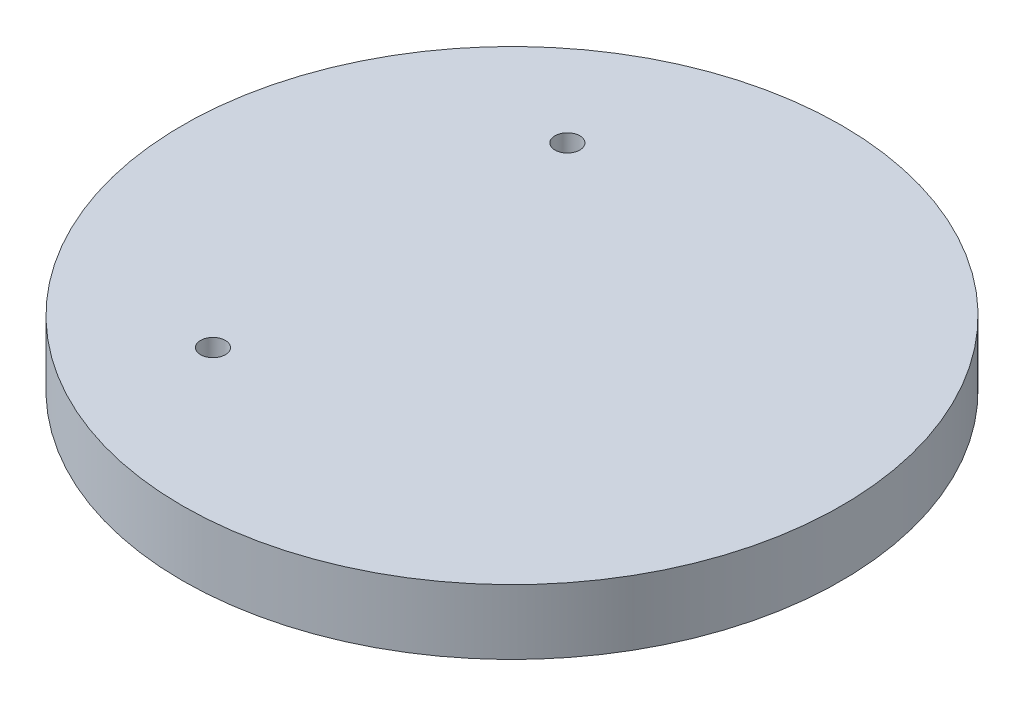
ISO-10303-21;
HEADER;
FILE_DESCRIPTION(('STEP AP214'),'2;1');
FILE_NAME('part.step','',(''),(''),'','','');
FILE_SCHEMA(('AUTOMOTIVE_DESIGN { 1 0 10303 214 1 1 1 1 }'));
ENDSEC;
DATA;
#1=APPLICATION_CONTEXT('core data for automotive mechanical design processes');
#2=APPLICATION_PROTOCOL_DEFINITION('international standard','automotive_design',2000,#1);
#3=PRODUCT_CONTEXT('',#1,'mechanical');
#4=PRODUCT('Part','Part','',(#3));
#5=PRODUCT_RELATED_PRODUCT_CATEGORY('part','',(#4));
#6=PRODUCT_DEFINITION_FORMATION('','',#4);
#7=PRODUCT_DEFINITION_CONTEXT('part definition',#1,'design');
#8=PRODUCT_DEFINITION('design','',#6,#7);
#9=PRODUCT_DEFINITION_SHAPE('','',#8);
#10=(LENGTH_UNIT() NAMED_UNIT(*) SI_UNIT(.MILLI.,.METRE.));
#11=(NAMED_UNIT(*) PLANE_ANGLE_UNIT() SI_UNIT($,.RADIAN.));
#12=(NAMED_UNIT(*) SI_UNIT($,.STERADIAN.) SOLID_ANGLE_UNIT());
#13=UNCERTAINTY_MEASURE_WITH_UNIT(LENGTH_MEASURE(1.E-05),#10,'distance_accuracy_value','');
#14=(GEOMETRIC_REPRESENTATION_CONTEXT(3) GLOBAL_UNCERTAINTY_ASSIGNED_CONTEXT((#13)) GLOBAL_UNIT_ASSIGNED_CONTEXT((#10,
#11,#12)) REPRESENTATION_CONTEXT('',''));
#15=CARTESIAN_POINT('',(0.,0.,0.));
#16=DIRECTION('',(0.,0.,1.));
#17=DIRECTION('',(1.,0.,0.));
#18=AXIS2_PLACEMENT_3D('',#15,#16,#17);
#19=CARTESIAN_POINT('',(0.,4.,0.));
#20=DIRECTION('',(0.,1.,0.));
#21=DIRECTION('',(0.,0.,1.));
#22=AXIS2_PLACEMENT_3D('',#19,#20,#21);
#23=PLANE('',#22);
#24=CARTESIAN_POINT('',(0.,4.,0.));
#25=DIRECTION('',(0.,-1.,0.));
#26=DIRECTION('',(0.,0.,-1.));
#27=AXIS2_PLACEMENT_3D('',#24,#25,#26);
#28=CIRCLE('',#27,3.05);
#29=CARTESIAN_POINT('',(0.,4.,-3.05));
#30=VERTEX_POINT('',#29);
#31=EDGE_CURVE('E86',#30,#30,#28,.T.);
#32=ORIENTED_EDGE('',*,*,#31,.T.);
#33=EDGE_LOOP('',(#32));
#34=FACE_BOUND('',#33,.T.);
#35=ADVANCED_FACE('F39',(#34),#23,.F.);
#36=CARTESIAN_POINT('',(0.,0.,0.));
#37=DIRECTION('',(0.,-1.,0.));
#38=DIRECTION('',(0.,0.,-1.));
#39=AXIS2_PLACEMENT_3D('',#36,#37,#38);
#40=CYLINDRICAL_SURFACE('',#39,3.05);
#41=ORIENTED_EDGE('',*,*,#31,.F.);
#42=EDGE_LOOP('',(#41));
#43=FACE_BOUND('',#42,.T.);
#44=CARTESIAN_POINT('',(0.,0.,0.));
#45=DIRECTION('',(0.,-1.,0.));
#46=DIRECTION('',(0.,0.,-1.));
#47=AXIS2_PLACEMENT_3D('',#44,#45,#46);
#48=CIRCLE('',#47,3.05);
#49=CARTESIAN_POINT('',(0.,0.,-3.05));
#50=VERTEX_POINT('',#49);
#51=EDGE_CURVE('E91',#50,#50,#48,.T.);
#52=ORIENTED_EDGE('',*,*,#51,.T.);
#53=EDGE_LOOP('',(#52));
#54=FACE_BOUND('',#53,.T.);
#55=ADVANCED_FACE('F126',(#43,#54),#40,.F.);
#56=CARTESIAN_POINT('',(-3.05,0.,0.));
#57=DIRECTION('',(0.,1.,0.));
#58=DIRECTION('',(0.,0.,1.));
#59=AXIS2_PLACEMENT_3D('',#56,#57,#58);
#60=PLANE('',#59);
#61=ORIENTED_EDGE('',*,*,#51,.F.);
#62=EDGE_LOOP('',(#61));
#63=FACE_BOUND('',#62,.T.);
#64=CARTESIAN_POINT('',(0.,0.,0.));
#65=DIRECTION('',(0.,-1.,0.));
#66=DIRECTION('',(0.,0.,-1.));
#67=AXIS2_PLACEMENT_3D('',#64,#65,#66);
#68=CIRCLE('',#67,5.05);
#69=CARTESIAN_POINT('',(0.,0.,-5.05));
#70=VERTEX_POINT('',#69);
#71=EDGE_CURVE('E143',#70,#70,#68,.T.);
#72=ORIENTED_EDGE('',*,*,#71,.T.);
#73=EDGE_LOOP('',(#72));
#74=FACE_BOUND('',#73,.T.);
#75=ADVANCED_FACE('F122',(#63,#74),#60,.F.);
#76=CARTESIAN_POINT('',(-5.05,4.,0.));
#77=DIRECTION('',(0.,1.,0.));
#78=DIRECTION('',(0.,0.,1.));
#79=AXIS2_PLACEMENT_3D('',#76,#77,#78);
#80=PLANE('',#79);
#81=CARTESIAN_POINT('',(0.,4.,0.));
#82=DIRECTION('',(0.,1.,0.));
#83=DIRECTION('',(0.,0.,1.));
#84=AXIS2_PLACEMENT_3D('',#81,#82,#83);
#85=CIRCLE('',#84,13.05);
#86=CARTESIAN_POINT('',(0.,4.,13.05));
#87=VERTEX_POINT('',#86);
#88=EDGE_CURVE('E76',#87,#87,#85,.T.);
#89=ORIENTED_EDGE('',*,*,#88,.T.);
#90=EDGE_LOOP('',(#89));
#91=FACE_BOUND('',#90,.T.);
#92=CARTESIAN_POINT('',(0.,4.,0.));
#93=DIRECTION('',(0.,1.,0.));
#94=DIRECTION('',(0.,0.,1.));
#95=AXIS2_PLACEMENT_3D('',#92,#93,#94);
#96=CIRCLE('',#95,20.5);
#97=CARTESIAN_POINT('',(-10.7788808870015,4.,-17.4374805182352));
#98=VERTEX_POINT('',#97);
#99=CARTESIAN_POINT('',(-10.7788808870015,4.,17.4374805182352));
#100=VERTEX_POINT('',#99);
#101=EDGE_CURVE('E80',#98,#100,#96,.F.);
#102=ORIENTED_EDGE('',*,*,#101,.T.);
#103=CARTESIAN_POINT('',(-11.275,4.,16.4));
#104=DIRECTION('',(0.,1.,0.));
#105=DIRECTION('',(0.,0.,1.));
#106=AXIS2_PLACEMENT_3D('',#103,#104,#105);
#107=CIRCLE('',#106,1.15);
#108=CARTESIAN_POINT('',(-12.4213374606727,4.,16.3082916238363));
#109=VERTEX_POINT('',#108);
#110=EDGE_CURVE('E66',#100,#109,#107,.T.);
#111=ORIENTED_EDGE('',*,*,#110,.T.);
#112=CARTESIAN_POINT('',(-12.4213374606727,4.,-16.3082916238363));
#113=VERTEX_POINT('',#112);
#114=EDGE_CURVE('E81',#109,#113,#96,.F.);
#115=ORIENTED_EDGE('',*,*,#114,.T.);
#116=CARTESIAN_POINT('',(-11.275,4.,-16.4));
#117=DIRECTION('',(0.,1.,0.));
#118=DIRECTION('',(0.,0.,1.));
#119=AXIS2_PLACEMENT_3D('',#116,#117,#118);
#120=CIRCLE('',#119,1.15);
#121=EDGE_CURVE('E59',#113,#98,#120,.T.);
#122=ORIENTED_EDGE('',*,*,#121,.T.);
#123=EDGE_LOOP('',(#102,#111,#115,#122));
#124=FACE_BOUND('',#123,.T.);
#125=ADVANCED_FACE('F79',(#91,#124),#80,.F.);
#126=CARTESIAN_POINT('',(-28.5,0.,0.));
#127=DIRECTION('',(0.,1.,0.));
#128=DIRECTION('',(0.,0.,1.));
#129=AXIS2_PLACEMENT_3D('',#126,#127,#128);
#130=PLANE('',#129);
#131=CARTESIAN_POINT('',(0.,0.,0.));
#132=DIRECTION('',(0.,-1.,0.));
#133=DIRECTION('',(0.,0.,-1.));
#134=AXIS2_PLACEMENT_3D('',#131,#132,#133);
#135=CIRCLE('',#134,28.5);
#136=CARTESIAN_POINT('',(0.,0.,-28.5));
#137=VERTEX_POINT('',#136);
#138=EDGE_CURVE('E146',#137,#137,#135,.T.);
#139=ORIENTED_EDGE('',*,*,#138,.F.);
#140=EDGE_LOOP('',(#139));
#141=FACE_BOUND('',#140,.T.);
#142=CARTESIAN_POINT('',(0.,0.,0.));
#143=DIRECTION('',(0.,-1.,0.));
#144=DIRECTION('',(0.,0.,-1.));
#145=AXIS2_PLACEMENT_3D('',#142,#143,#144);
#146=CIRCLE('',#145,30.5);
#147=CARTESIAN_POINT('',(0.,0.,-30.5));
#148=VERTEX_POINT('',#147);
#149=EDGE_CURVE('E152',#148,#148,#146,.T.);
#150=ORIENTED_EDGE('',*,*,#149,.T.);
#151=EDGE_LOOP('',(#150));
#152=FACE_BOUND('',#151,.T.);
#153=ADVANCED_FACE('F115',(#141,#152),#130,.F.);
#154=CARTESIAN_POINT('',(0.,0.,0.));
#155=DIRECTION('',(0.,-1.,0.));
#156=DIRECTION('',(0.,0.,-1.));
#157=AXIS2_PLACEMENT_3D('',#154,#155,#156);
#158=CYLINDRICAL_SURFACE('',#157,30.5);
#159=ORIENTED_EDGE('',*,*,#149,.F.);
#160=EDGE_LOOP('',(#159));
#161=FACE_BOUND('',#160,.T.);
#162=CARTESIAN_POINT('',(0.,6.,0.));
#163=DIRECTION('',(0.,-1.,0.));
#164=DIRECTION('',(0.,0.,-1.));
#165=AXIS2_PLACEMENT_3D('',#162,#163,#164);
#166=CIRCLE('',#165,30.5);
#167=CARTESIAN_POINT('',(0.,6.,-30.5));
#168=VERTEX_POINT('',#167);
#169=EDGE_CURVE('E158',#168,#168,#166,.T.);
#170=ORIENTED_EDGE('',*,*,#169,.T.);
#171=EDGE_LOOP('',(#170));
#172=FACE_BOUND('',#171,.T.);
#173=ADVANCED_FACE('F111',(#161,#172),#158,.T.);
#174=CARTESIAN_POINT('',(-30.5,6.,0.));
#175=DIRECTION('',(0.,-1.,0.));
#176=DIRECTION('',(0.,0.,-1.));
#177=AXIS2_PLACEMENT_3D('',#174,#175,#176);
#178=PLANE('',#177);
#179=CARTESIAN_POINT('',(-11.275,6.,16.4));
#180=DIRECTION('',(0.,1.,0.));
#181=DIRECTION('',(0.,0.,1.));
#182=AXIS2_PLACEMENT_3D('',#179,#180,#181);
#183=CIRCLE('',#182,1.15);
#184=CARTESIAN_POINT('',(-11.275,6.,17.55));
#185=VERTEX_POINT('',#184);
#186=EDGE_CURVE('E83',#185,#185,#183,.T.);
#187=ORIENTED_EDGE('',*,*,#186,.F.);
#188=EDGE_LOOP('',(#187));
#189=FACE_BOUND('',#188,.T.);
#190=CARTESIAN_POINT('',(-11.275,6.,-16.4));
#191=DIRECTION('',(0.,1.,0.));
#192=DIRECTION('',(0.,0.,1.));
#193=AXIS2_PLACEMENT_3D('',#190,#191,#192);
#194=CIRCLE('',#193,1.15);
#195=CARTESIAN_POINT('',(-11.275,6.,-15.25));
#196=VERTEX_POINT('',#195);
#197=EDGE_CURVE('E164',#196,#196,#194,.T.);
#198=ORIENTED_EDGE('',*,*,#197,.F.);
#199=EDGE_LOOP('',(#198));
#200=FACE_BOUND('',#199,.T.);
#201=ORIENTED_EDGE('',*,*,#169,.F.);
#202=EDGE_LOOP('',(#201));
#203=FACE_BOUND('',#202,.T.);
#204=ADVANCED_FACE('F107',(#189,#200,#203),#178,.F.);
#205=CARTESIAN_POINT('',(0.,-6.,0.));
#206=DIRECTION('',(0.,1.,0.));
#207=DIRECTION('',(0.,0.,1.));
#208=AXIS2_PLACEMENT_3D('',#205,#206,#207);
#209=TOROIDAL_SURFACE('',#208,13.05,10.);
#210=ORIENTED_EDGE('',*,*,#88,.F.);
#211=EDGE_LOOP('',(#210));
#212=FACE_BOUND('',#211,.T.);
#213=ORIENTED_EDGE('',*,*,#71,.F.);
#214=EDGE_LOOP('',(#213));
#215=FACE_BOUND('',#214,.T.);
#216=ADVANCED_FACE('F110',(#212,#215),#209,.F.);
#217=CARTESIAN_POINT('',(0.,-6.,0.));
#218=DIRECTION('',(0.,-1.,0.));
#219=DIRECTION('',(0.,0.,-1.));
#220=AXIS2_PLACEMENT_3D('',#217,#218,#219);
#221=TOROIDAL_SURFACE('',#220,20.5,10.);
#222=ORIENTED_EDGE('',*,*,#138,.T.);
#223=EDGE_LOOP('',(#222));
#224=FACE_BOUND('',#223,.T.);
#225=ORIENTED_EDGE('',*,*,#114,.F.);
#226=CARTESIAN_POINT('',(-12.0641962646348,3.96729070003459,15.563537082795));
#227=CARTESIAN_POINT('',(-12.1108688465725,3.9724304983829,15.6075757823465));
#228=CARTESIAN_POINT('',(-12.15390680917,3.97703062283287,15.6555863664808));
#229=CARTESIAN_POINT('',(-12.2314312152825,3.98497070246598,15.7582194387302));
#230=CARTESIAN_POINT('',(-12.26590953138,3.98830946153501,15.8128481381102));
#231=CARTESIAN_POINT('',(-12.3252618928955,3.99368879944118,15.9271427969775));
#232=CARTESIAN_POINT('',(-12.3501382625853,3.99572969252066,15.9868075331618));
#233=CARTESIAN_POINT('',(-12.3895594849683,3.99861367015127,16.1094710913706));
#234=CARTESIAN_POINT('',(-12.4041062666377,3.99945697837216,16.1724692885329));
#235=CARTESIAN_POINT('',(-12.4224397706357,4.00015597014309,16.2999056933576));
#236=CARTESIAN_POINT('',(-12.4262449686752,4.00001335096494,16.3643412360576));
#237=CARTESIAN_POINT('',(-12.4230416492011,3.99902889969247,16.4929392046088));
#238=CARTESIAN_POINT('',(-12.4160326247831,3.99818703482265,16.5571016175158));
#239=CARTESIAN_POINT('',(-12.3913613535137,3.99612218269179,16.6835484335793));
#240=CARTESIAN_POINT('',(-12.373665579337,3.99489800185922,16.7458262759152));
#241=CARTESIAN_POINT('',(-12.3280930781766,3.99239151132303,16.8665373617605));
#242=CARTESIAN_POINT('',(-12.3002162370564,3.99110920096787,16.9249705621603));
#243=CARTESIAN_POINT('',(-12.2349874732315,3.98876667966014,17.0364795021405));
#244=CARTESIAN_POINT('',(-12.1976129974168,3.98770700848436,17.0895420632423));
#245=CARTESIAN_POINT('',(-12.1144803966403,3.98602771853294,17.1886415757624));
#246=CARTESIAN_POINT('',(-12.0687223414579,3.98540809609482,17.234678585651));
#247=CARTESIAN_POINT('',(-11.9701631856228,3.98472847838988,17.3183815645245));
#248=CARTESIAN_POINT('',(-11.9173679381607,3.98466802094728,17.3560544217242));
#249=CARTESIAN_POINT('',(-11.8062064895666,3.98511695644138,17.4220060077331));
#250=CARTESIAN_POINT('',(-11.7478402990473,3.98562634829253,17.4502847544377));
#251=CARTESIAN_POINT('',(-11.6272391508194,3.98711706372981,17.4966302190514));
#252=CARTESIAN_POINT('',(-11.5650069624454,3.98809805281444,17.5147041554519));
#253=CARTESIAN_POINT('',(-11.4383977910351,3.99033684930768,17.5401626099078));
#254=CARTESIAN_POINT('',(-11.374020783426,3.99159465988868,17.5475470054527));
#255=CARTESIAN_POINT('',(-11.2448624885427,3.99411730439226,17.5514212633088));
#256=CARTESIAN_POINT('',(-11.1800808096466,3.99538214491859,17.5478980769387));
#257=CARTESIAN_POINT('',(-11.0520220176414,3.99759849227778,17.5300267215526));
#258=CARTESIAN_POINT('',(-10.9887449070272,3.99854999859107,17.5156785345869));
#259=CARTESIAN_POINT('',(-10.8654929416463,3.99981044546551,17.476561194274));
#260=CARTESIAN_POINT('',(-10.8055179566819,4.00011941137873,17.4517924521267));
#261=CARTESIAN_POINT('',(-10.6905798667752,3.99979514717849,17.3925387838261));
#262=CARTESIAN_POINT('',(-10.6356166239169,3.99916194300053,17.358054125148));
#263=CARTESIAN_POINT('',(-10.532446744914,3.99672746467649,17.2804918202239));
#264=CARTESIAN_POINT('',(-10.4842182785075,3.99493007626412,17.2374430885346));
#265=CARTESIAN_POINT('',(-10.3956704678093,3.99004753653751,17.1439260651818));
#266=CARTESIAN_POINT('',(-10.3553509613288,3.9869624116349,17.0934579257051));
#267=CARTESIAN_POINT('',(-10.283812678502,3.97951781059458,16.9866609820379));
#268=CARTESIAN_POINT('',(-10.2525771955341,3.97516070375254,16.9303431983876));
#269=CARTESIAN_POINT('',(-10.1999491815605,3.96531698120234,16.8133751924759));
#270=CARTESIAN_POINT('',(-10.1785569740693,3.95983032837848,16.7527248278931));
#271=CARTESIAN_POINT('',(-10.1460801501795,3.94797774745145,16.6284465737471));
#272=CARTESIAN_POINT('',(-10.1350532116968,3.94160712297708,16.5648040682381));
#273=CARTESIAN_POINT('',(-10.1237833148234,3.92841615066164,16.4366157368507));
#274=CARTESIAN_POINT('',(-10.1235410948205,3.92159577205968,16.3720698494239));
#275=CARTESIAN_POINT('',(-10.1338841144998,3.90793778925877,16.243265174907));
#276=CARTESIAN_POINT('',(-10.1445658733243,3.9011005732991,16.1790140736723));
#277=CARTESIAN_POINT('',(-10.1766256398504,3.88802194355998,16.0531719347298));
#278=CARTESIAN_POINT('',(-10.1980037334726,3.88178053456694,15.9915809183941));
#279=CARTESIAN_POINT('',(-10.2508826090731,3.87043965774872,15.8728329550169));
#280=CARTESIAN_POINT('',(-10.2823776354425,3.86533954342364,15.815673509714));
#281=CARTESIAN_POINT('',(-10.3546404011258,3.85674934125858,15.7074161536581));
#282=CARTESIAN_POINT('',(-10.395407239889,3.85325909715512,15.6563176549515));
#283=CARTESIAN_POINT('',(-10.4844386956958,3.84826155067619,15.5623581525964));
#284=CARTESIAN_POINT('',(-10.5325923115461,3.84672759910788,15.5193933862883));
#285=CARTESIAN_POINT('',(-10.6354123824804,3.84570363973063,15.4421047849487));
#286=CARTESIAN_POINT('',(-10.690078354719,3.84621348048026,15.4077803098872));
#287=CARTESIAN_POINT('',(-10.8036918089605,3.8492098863707,15.3490899762683));
#288=CARTESIAN_POINT('',(-10.8625849718848,3.85167442573703,15.3246177075824));
#289=CARTESIAN_POINT('',(-10.9835101066902,3.85832072995527,15.2857435410251));
#290=CARTESIAN_POINT('',(-11.045542086583,3.86250249919055,15.2713416688596));
#291=CARTESIAN_POINT('',(-11.1714055475654,3.87223427969665,15.2528999356052));
#292=CARTESIAN_POINT('',(-11.2352456590115,3.87779243324241,15.2489234315624));
#293=CARTESIAN_POINT('',(-11.3626380788004,3.88978332045852,15.2515750685329));
#294=CARTESIAN_POINT('',(-11.4261902951234,3.89621631582437,15.2582063891272));
#295=CARTESIAN_POINT('',(-11.5522656845241,3.90953673276969,15.2820532496095));
#296=CARTESIAN_POINT('',(-11.6147572409881,3.91642968606291,15.2994326251204));
#297=CARTESIAN_POINT('',(-11.7359097196405,3.93003993964158,15.344429060732));
#298=CARTESIAN_POINT('',(-11.7945744015789,3.93675740832046,15.3720358890336));
#299=CARTESIAN_POINT('',(-11.8890200567985,3.94755807838673,15.4266233557231));
#300=CARTESIAN_POINT('',(-11.9262389182307,3.95181026752126,15.4511227007358));
#301=CARTESIAN_POINT('',(-11.9976215236691,3.95989195465628,15.5042885954651));
#302=CARTESIAN_POINT('',(-12.0317852692369,3.96372145287283,15.5329551430516));
#303=CARTESIAN_POINT('',(-12.0641962646348,3.96729070003459,15.563537082795));
#304=B_SPLINE_CURVE_WITH_KNOTS('',3,(#226,#227,#228,#229,#230,#231,#232,#233,#234,#235,#236,
#237,#238,#239,#240,#241,#242,#243,#244,#245,#246,#247,#248,#249,#250,#251,#252,#253,#254,#255,
#256,#257,#258,#259,#260,#261,#262,#263,#264,#265,#266,#267,#268,#269,#270,#271,#272,#273,#274,
#275,#276,#277,#278,#279,#280,#281,#282,#283,#284,#285,#286,#287,#288,#289,#290,#291,#292,#293,
#294,#295,#296,#297,#298,#299,#300,#301,#302,#303),.UNSPECIFIED.,.T.,.F.,(4,2,2,2,2,2,2,2,2,2,2,
2,2,2,2,2,2,2,2,2,2,2,2,2,2,2,2,2,2,2,2,2,2,2,2,2,2,2,4),(0.,0.192964384500629,
0.386111294644531,0.579211421785648,0.772275479380627,0.965007260499761,1.15774807597633,
1.35109673758381,1.54444756682237,1.7382618892313,1.93207459852793,2.1257270983126,
2.31937922919622,2.51289420582542,2.70641140027241,2.90016018771223,3.09390929642386,
3.28765076042665,3.48138689132733,3.67447969234269,3.86756853319372,4.0602999814241,
4.25303776361885,4.44684180148586,4.64065910834089,4.83620381494512,5.03175009232868,
5.22718531821769,5.42260157001628,5.61532633097888,5.80803681163873,5.99860613968336,
6.18917595417467,6.38090124337909,6.57268401093597,6.76746479200181,6.96205123342201,
7.09605219748293,7.23005309304814),.UNSPECIFIED.);
#305=EDGE_CURVE('E11',#109,#100,#304,.T.);
#306=ORIENTED_EDGE('',*,*,#305,.T.);
#307=ORIENTED_EDGE('',*,*,#101,.F.);
#308=CARTESIAN_POINT('',(-11.9131601503107,3.9847646065815,-17.3566878396611));
#309=CARTESIAN_POINT('',(-11.966870471326,3.98471793047386,-17.3208570324329));
#310=CARTESIAN_POINT('',(-12.0175907501239,3.98495890440784,-17.280469831335));
#311=CARTESIAN_POINT('',(-12.1115689753409,3.98597371846615,-17.1917306873633));
#312=CARTESIAN_POINT('',(-12.154818994332,3.98674812037052,-17.1433703884976));
#313=CARTESIAN_POINT('',(-12.2325710198539,3.98867853534153,-17.0401027548066));
#314=CARTESIAN_POINT('',(-12.267077157938,3.98983436758266,-16.9851985301383));
#315=CARTESIAN_POINT('',(-12.3263813320939,3.99228915311749,-16.8703948572138));
#316=CARTESIAN_POINT('',(-12.3511813361775,3.99358807732941,-16.810496424572));
#317=CARTESIAN_POINT('',(-12.3904040304806,3.9960302728211,-16.6873241714472));
#318=CARTESIAN_POINT('',(-12.4048164671741,3.99717338940398,-16.6240470818821));
#319=CARTESIAN_POINT('',(-12.4228126068311,3.99897314763492,-16.4959619824377));
#320=CARTESIAN_POINT('',(-12.4263960294862,3.99962977668995,-16.4311539329736));
#321=CARTESIAN_POINT('',(-12.4226298776612,4.00013709170378,-16.3019141441673));
#322=CARTESIAN_POINT('',(-12.4152907646624,3.99998854848758,-16.2374821040074));
#323=CARTESIAN_POINT('',(-12.3899093884906,3.99861957498648,-16.1107743080629));
#324=CARTESIAN_POINT('',(-12.3718674713986,3.99739917935991,-16.0484984826249));
#325=CARTESIAN_POINT('',(-12.3256944335683,3.99371463847406,-15.9281073718391));
#326=CARTESIAN_POINT('',(-12.2976002905262,3.99125503834251,-15.8699777621966));
#327=CARTESIAN_POINT('',(-12.2321368449893,3.98503662281823,-15.7592785108232));
#328=CARTESIAN_POINT('',(-12.1947676447879,3.98127782175402,-15.7067088077821));
#329=CARTESIAN_POINT('',(-12.1118555784627,3.97254166352488,-15.6086111419444));
#330=CARTESIAN_POINT('',(-12.0663147944526,3.96756461665076,-15.5630813908621));
#331=CARTESIAN_POINT('',(-11.9683580750138,3.95661136239458,-15.4802893167905));
#332=CARTESIAN_POINT('',(-11.9159418077776,3.95063510678737,-15.4430273930364));
#333=CARTESIAN_POINT('',(-11.8052961240913,3.93798495576586,-15.3775277533828));
#334=CARTESIAN_POINT('',(-11.7470268712766,3.93130626264046,-15.3493582671306));
#335=CARTESIAN_POINT('',(-11.6266137886381,3.91774738328755,-15.3031743726041));
#336=CARTESIAN_POINT('',(-11.5644697133563,3.91086718430993,-15.2851606083908));
#337=CARTESIAN_POINT('',(-11.4375185732071,3.89737938745133,-15.2596882147293));
#338=CARTESIAN_POINT('',(-11.372694676608,3.89077429901957,-15.2523119992074));
#339=CARTESIAN_POINT('',(-11.2426460956945,3.87845029806027,-15.2486163221597));
#340=CARTESIAN_POINT('',(-11.1774214201139,3.87273136629232,-15.252296620537));
#341=CARTESIAN_POINT('',(-11.0487149811566,3.86271829082051,-15.2706191785813));
#342=CARTESIAN_POINT('',(-10.9852267024108,3.8584178596171,-15.2852121008529));
#343=CARTESIAN_POINT('',(-10.8615359002446,3.8516140026433,-15.3249346704543));
#344=CARTESIAN_POINT('',(-10.8013330181835,3.8491103803655,-15.3500631650885));
#345=CARTESIAN_POINT('',(-10.6868705835908,3.84616793599982,-15.4096943576131));
#346=CARTESIAN_POINT('',(-10.6325348511842,3.84569842790075,-15.444049376158));
#347=CARTESIAN_POINT('',(-10.5303511487566,3.84678553061733,-15.5213076746892));
#348=CARTESIAN_POINT('',(-10.4825028690166,3.84834204467056,-15.5642105463488));
#349=CARTESIAN_POINT('',(-10.3949712259571,3.85331262646663,-15.6569742957533));
#350=CARTESIAN_POINT('',(-10.3552311861669,3.85671314617482,-15.7067824770804));
#351=CARTESIAN_POINT('',(-10.2845503303883,3.86504850945351,-15.8121767953928));
#352=CARTESIAN_POINT('',(-10.2536100297248,3.869983442846,-15.8677632705029));
#353=CARTESIAN_POINT('',(-10.2010606820507,3.88100900505668,-15.98376659631));
#354=CARTESIAN_POINT('',(-10.179550120738,3.8871109178438,-16.0442269662232));
#355=CARTESIAN_POINT('',(-10.1468691328842,3.89992126421521,-16.1678200896832));
#356=CARTESIAN_POINT('',(-10.1356995884741,3.90662974948904,-16.2309530707343));
#357=CARTESIAN_POINT('',(-10.1239022729154,3.92022254364674,-16.359101258699));
#358=CARTESIAN_POINT('',(-10.1234273948368,3.9271079951933,-16.4241304703929));
#359=CARTESIAN_POINT('',(-10.1334333372305,3.94045155053425,-16.553386565051));
#360=CARTESIAN_POINT('',(-10.143914296191,3.94690964892556,-16.6176134378629));
#361=CARTESIAN_POINT('',(-10.1756028146411,3.95898854466708,-16.7435871465216));
#362=CARTESIAN_POINT('',(-10.1968316287668,3.96460765423507,-16.8053288054973));
#363=CARTESIAN_POINT('',(-10.2494625734391,3.97469030718667,-16.9244141247753));
#364=CARTESIAN_POINT('',(-10.2808641967152,3.97915390817013,-16.9817580041981));
#365=CARTESIAN_POINT('',(-10.3526577268405,3.98673473826861,-17.089899218343));
#366=CARTESIAN_POINT('',(-10.3929703803735,3.98986316467343,-17.140748387113));
#367=CARTESIAN_POINT('',(-10.4816006341997,3.9948191777431,-17.2349856370223));
#368=CARTESIAN_POINT('',(-10.5299179701242,3.99664680735852,-17.2783739644726));
#369=CARTESIAN_POINT('',(-10.6328571996043,3.99911675550774,-17.3561852259995));
#370=CARTESIAN_POINT('',(-10.6874386161849,3.99976627375334,-17.3906615051721));
#371=CARTESIAN_POINT('',(-10.8015938911423,4.00012717871178,-17.4500119080656));
#372=CARTESIAN_POINT('',(-10.8611676255334,3.99983858871608,-17.474886270167));
#373=CARTESIAN_POINT('',(-10.9837062341919,3.99861647883422,-17.514359521018));
#374=CARTESIAN_POINT('',(-11.0466754624016,3.99768211184032,-17.5289448621485));
#375=CARTESIAN_POINT('',(-11.1741761820926,3.99549254024171,-17.5473814237933));
#376=CARTESIAN_POINT('',(-11.2387080356758,3.9942372606163,-17.5512301318637));
#377=CARTESIAN_POINT('',(-11.3677508565331,3.99171738143654,-17.5480768218124));
#378=CARTESIAN_POINT('',(-11.4322607819682,3.99045276461022,-17.5410328684331));
#379=CARTESIAN_POINT('',(-11.5591388729567,3.98819513758637,-17.5162146496359));
#380=CARTESIAN_POINT('',(-11.6215092249508,3.98720184242771,-17.4984517054931));
#381=CARTESIAN_POINT('',(-11.722546334946,3.98593062408465,-17.4602327808306));
#382=CARTESIAN_POINT('',(-11.7622888925066,3.98552496309392,-17.4425618816062));
#383=CARTESIAN_POINT('',(-11.8395256081393,3.98495765805421,-17.4028442531824));
#384=CARTESIAN_POINT('',(-11.8770197680019,3.98479601381093,-17.3807975274675));
#385=CARTESIAN_POINT('',(-11.9131601503107,3.9847646065815,-17.3566878396611));
#386=B_SPLINE_CURVE_WITH_KNOTS('',3,(#308,#309,#310,#311,#312,#313,#314,#315,#316,#317,#318,
#319,#320,#321,#322,#323,#324,#325,#326,#327,#328,#329,#330,#331,#332,#333,#334,#335,#336,#337,
#338,#339,#340,#341,#342,#343,#344,#345,#346,#347,#348,#349,#350,#351,#352,#353,#354,#355,#356,
#357,#358,#359,#360,#361,#362,#363,#364,#365,#366,#367,#368,#369,#370,#371,#372,#373,#374,#375,
#376,#377,#378,#379,#380,#381,#382,#383,#384,#385),.UNSPECIFIED.,.T.,.F.,(4,2,2,2,2,2,2,2,2,2,2,
2,2,2,2,2,2,2,2,2,2,2,2,2,2,2,2,2,2,2,2,2,2,2,2,2,2,2,4),(0.,0.193537194827229,
0.387278525741286,0.580928140913578,0.77453847140157,0.96833965310047,1.16214585128811,
1.35576654350865,1.54938097523747,1.7422903862321,1.93519766975075,2.12805587024703,
2.32092338141268,2.51520622682704,2.70950139198885,2.90529390970572,3.10108217573585,
3.29599056904944,3.49087764302192,3.68281424274358,3.8747416759459,4.06527774181889,
4.25582496345222,4.44831744757668,4.64082635058189,4.83608567873245,5.03134747510574,
5.2269969325078,5.42263663528794,5.61660175299397,5.81056046593352,6.00332980640976,
6.19609436082231,6.38911225817585,6.58217531921886,6.77598349916898,6.96958733854218,
7.0998139625753,7.23004048291249),.UNSPECIFIED.);
#387=EDGE_CURVE('E53',#98,#113,#386,.T.);
#388=ORIENTED_EDGE('',*,*,#387,.T.);
#389=EDGE_LOOP('',(#225,#306,#307,#388));
#390=FACE_BOUND('',#389,.T.);
#391=ADVANCED_FACE('F41',(#224,#390),#221,.F.);
#392=CARTESIAN_POINT('',(-11.275,-4.,-16.4));
#393=DIRECTION('',(0.,1.,0.));
#394=DIRECTION('',(0.,0.,1.));
#395=AXIS2_PLACEMENT_3D('',#392,#393,#394);
#396=CYLINDRICAL_SURFACE('',#395,1.15);
#397=ORIENTED_EDGE('',*,*,#197,.T.);
#398=EDGE_LOOP('',(#397));
#399=FACE_BOUND('',#398,.T.);
#400=ORIENTED_EDGE('',*,*,#387,.F.);
#401=ORIENTED_EDGE('',*,*,#121,.F.);
#402=EDGE_LOOP('',(#400,#401));
#403=FACE_BOUND('',#402,.T.);
#404=ADVANCED_FACE('F70',(#399,#403),#396,.F.);
#405=CARTESIAN_POINT('',(-11.275,-4.,16.4));
#406=DIRECTION('',(0.,1.,0.));
#407=DIRECTION('',(0.,0.,1.));
#408=AXIS2_PLACEMENT_3D('',#405,#406,#407);
#409=CYLINDRICAL_SURFACE('',#408,1.15);
#410=ORIENTED_EDGE('',*,*,#186,.T.);
#411=EDGE_LOOP('',(#410));
#412=FACE_BOUND('',#411,.T.);
#413=ORIENTED_EDGE('',*,*,#305,.F.);
#414=ORIENTED_EDGE('',*,*,#110,.F.);
#415=EDGE_LOOP('',(#413,#414));
#416=FACE_BOUND('',#415,.T.);
#417=ADVANCED_FACE('F104',(#412,#416),#409,.F.);
#418=CLOSED_SHELL('',(#35,#55,#75,#125,#153,#173,#204,#216,#391,#404,#417));
#419=MANIFOLD_SOLID_BREP('B2',#418);
#420=ADVANCED_BREP_SHAPE_REPRESENTATION('',(#18,#419),#14);
#421=SHAPE_DEFINITION_REPRESENTATION(#9,#420);
ENDSEC;
END-ISO-10303-21;
